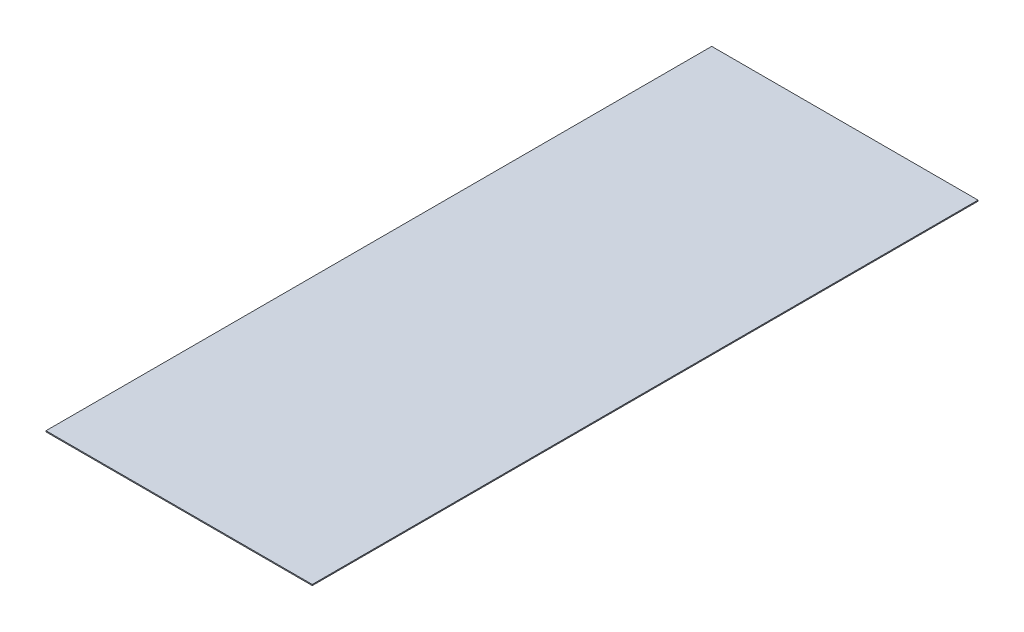
ISO-10303-21;
HEADER;
FILE_DESCRIPTION(('STEP AP214'),'2;1');
FILE_NAME('part.step','',(''),(''),'','','');
FILE_SCHEMA(('AUTOMOTIVE_DESIGN { 1 0 10303 214 1 1 1 1 }'));
ENDSEC;
DATA;
#1=APPLICATION_CONTEXT('core data for automotive mechanical design processes');
#2=APPLICATION_PROTOCOL_DEFINITION('international standard','automotive_design',2000,#1);
#3=PRODUCT_CONTEXT('',#1,'mechanical');
#4=PRODUCT('Part','Part','',(#3));
#5=PRODUCT_RELATED_PRODUCT_CATEGORY('part','',(#4));
#6=PRODUCT_DEFINITION_FORMATION('','',#4);
#7=PRODUCT_DEFINITION_CONTEXT('part definition',#1,'design');
#8=PRODUCT_DEFINITION('design','',#6,#7);
#9=PRODUCT_DEFINITION_SHAPE('','',#8);
#10=(LENGTH_UNIT() NAMED_UNIT(*) SI_UNIT(.MILLI.,.METRE.));
#11=(NAMED_UNIT(*) PLANE_ANGLE_UNIT() SI_UNIT($,.RADIAN.));
#12=(NAMED_UNIT(*) SI_UNIT($,.STERADIAN.) SOLID_ANGLE_UNIT());
#13=UNCERTAINTY_MEASURE_WITH_UNIT(LENGTH_MEASURE(1.E-05),#10,'distance_accuracy_value','');
#14=(GEOMETRIC_REPRESENTATION_CONTEXT(3) GLOBAL_UNCERTAINTY_ASSIGNED_CONTEXT((#13)) GLOBAL_UNIT_ASSIGNED_CONTEXT((#10,
#11,#12)) REPRESENTATION_CONTEXT('',''));
#15=CARTESIAN_POINT('',(0.,0.,0.));
#16=DIRECTION('',(0.,0.,1.));
#17=DIRECTION('',(1.,0.,0.));
#18=AXIS2_PLACEMENT_3D('',#15,#16,#17);
#19=CARTESIAN_POINT('',(609.6,4.8,1524.));
#20=DIRECTION('',(-1.,0.,0.));
#21=DIRECTION('',(0.,0.,1.));
#22=AXIS2_PLACEMENT_3D('',#19,#20,#21);
#23=PLANE('',#22);
#24=DIRECTION('',(0.,0.,-1.));
#25=VECTOR('',#24,1.);
#26=CARTESIAN_POINT('',(609.6,0.,1524.));
#27=LINE('',#26,#25);
#28=CARTESIAN_POINT('',(609.6,0.,1524.));
#29=VERTEX_POINT('',#28);
#30=CARTESIAN_POINT('',(609.6,0.,-1524.));
#31=VERTEX_POINT('',#30);
#32=EDGE_CURVE('E96',#29,#31,#27,.T.);
#33=ORIENTED_EDGE('',*,*,#32,.T.);
#34=DIRECTION('',(0.,-1.,0.));
#35=VECTOR('',#34,1.);
#36=CARTESIAN_POINT('',(609.6,4.8,-1524.));
#37=LINE('',#36,#35);
#38=CARTESIAN_POINT('',(609.6,4.8,-1524.));
#39=VERTEX_POINT('',#38);
#40=EDGE_CURVE('E11',#39,#31,#37,.T.);
#41=ORIENTED_EDGE('',*,*,#40,.F.);
#42=DIRECTION('',(0.,0.,-1.));
#43=VECTOR('',#42,1.);
#44=CARTESIAN_POINT('',(609.6,4.8,1524.));
#45=LINE('',#44,#43);
#46=CARTESIAN_POINT('',(609.6,4.8,1524.));
#47=VERTEX_POINT('',#46);
#48=EDGE_CURVE('E84',#47,#39,#45,.T.);
#49=ORIENTED_EDGE('',*,*,#48,.F.);
#50=DIRECTION('',(0.,-1.,0.));
#51=VECTOR('',#50,1.);
#52=CARTESIAN_POINT('',(609.6,4.8,1524.));
#53=LINE('',#52,#51);
#54=EDGE_CURVE('E92',#47,#29,#53,.T.);
#55=ORIENTED_EDGE('',*,*,#54,.T.);
#56=EDGE_LOOP('',(#33,#41,#49,#55));
#57=FACE_BOUND('',#56,.T.);
#58=ADVANCED_FACE('F33',(#57),#23,.F.);
#59=CARTESIAN_POINT('',(-609.6,4.8,-1524.));
#60=DIRECTION('',(0.,0.,1.));
#61=DIRECTION('',(1.,0.,0.));
#62=AXIS2_PLACEMENT_3D('',#59,#60,#61);
#63=PLANE('',#62);
#64=DIRECTION('',(-1.,0.,0.));
#65=VECTOR('',#64,1.);
#66=CARTESIAN_POINT('',(-609.6,0.,-1524.));
#67=LINE('',#66,#65);
#68=CARTESIAN_POINT('',(-609.6,0.,-1524.));
#69=VERTEX_POINT('',#68);
#70=EDGE_CURVE('E88',#31,#69,#67,.T.);
#71=ORIENTED_EDGE('',*,*,#70,.T.);
#72=DIRECTION('',(0.,-1.,0.));
#73=VECTOR('',#72,1.);
#74=CARTESIAN_POINT('',(-609.6,4.8,-1524.));
#75=LINE('',#74,#73);
#76=CARTESIAN_POINT('',(-609.6,4.8,-1524.));
#77=VERTEX_POINT('',#76);
#78=EDGE_CURVE('E41',#77,#69,#75,.T.);
#79=ORIENTED_EDGE('',*,*,#78,.F.);
#80=DIRECTION('',(-1.,0.,0.));
#81=VECTOR('',#80,1.);
#82=CARTESIAN_POINT('',(-609.6,4.8,-1524.));
#83=LINE('',#82,#81);
#84=EDGE_CURVE('E79',#39,#77,#83,.T.);
#85=ORIENTED_EDGE('',*,*,#84,.F.);
#86=ORIENTED_EDGE('',*,*,#40,.T.);
#87=EDGE_LOOP('',(#71,#79,#85,#86));
#88=FACE_BOUND('',#87,.T.);
#89=ADVANCED_FACE('F87',(#88),#63,.F.);
#90=CARTESIAN_POINT('',(-609.6,4.8,1524.));
#91=DIRECTION('',(1.,0.,0.));
#92=DIRECTION('',(0.,0.,-1.));
#93=AXIS2_PLACEMENT_3D('',#90,#91,#92);
#94=PLANE('',#93);
#95=DIRECTION('',(0.,0.,1.));
#96=VECTOR('',#95,1.);
#97=CARTESIAN_POINT('',(-609.6,0.,1524.));
#98=LINE('',#97,#96);
#99=CARTESIAN_POINT('',(-609.6,0.,1524.));
#100=VERTEX_POINT('',#99);
#101=EDGE_CURVE('E66',#69,#100,#98,.T.);
#102=ORIENTED_EDGE('',*,*,#101,.T.);
#103=DIRECTION('',(0.,-1.,0.));
#104=VECTOR('',#103,1.);
#105=CARTESIAN_POINT('',(-609.6,4.8,1524.));
#106=LINE('',#105,#104);
#107=CARTESIAN_POINT('',(-609.6,4.8,1524.));
#108=VERTEX_POINT('',#107);
#109=EDGE_CURVE('E89',#108,#100,#106,.T.);
#110=ORIENTED_EDGE('',*,*,#109,.F.);
#111=DIRECTION('',(0.,0.,1.));
#112=VECTOR('',#111,1.);
#113=CARTESIAN_POINT('',(-609.6,4.8,1524.));
#114=LINE('',#113,#112);
#115=EDGE_CURVE('E82',#77,#108,#114,.T.);
#116=ORIENTED_EDGE('',*,*,#115,.F.);
#117=ORIENTED_EDGE('',*,*,#78,.T.);
#118=EDGE_LOOP('',(#102,#110,#116,#117));
#119=FACE_BOUND('',#118,.T.);
#120=ADVANCED_FACE('F90',(#119),#94,.F.);
#121=CARTESIAN_POINT('',(-609.6,4.8,1524.));
#122=DIRECTION('',(0.,0.,-1.));
#123=DIRECTION('',(-1.,0.,0.));
#124=AXIS2_PLACEMENT_3D('',#121,#122,#123);
#125=PLANE('',#124);
#126=DIRECTION('',(1.,0.,0.));
#127=VECTOR('',#126,1.);
#128=CARTESIAN_POINT('',(-609.6,0.,1524.));
#129=LINE('',#128,#127);
#130=EDGE_CURVE('E72',#100,#29,#129,.T.);
#131=ORIENTED_EDGE('',*,*,#130,.T.);
#132=ORIENTED_EDGE('',*,*,#54,.F.);
#133=DIRECTION('',(1.,0.,0.));
#134=VECTOR('',#133,1.);
#135=CARTESIAN_POINT('',(-609.6,4.8,1524.));
#136=LINE('',#135,#134);
#137=EDGE_CURVE('E49',#108,#47,#136,.T.);
#138=ORIENTED_EDGE('',*,*,#137,.F.);
#139=ORIENTED_EDGE('',*,*,#109,.T.);
#140=EDGE_LOOP('',(#131,#132,#138,#139));
#141=FACE_BOUND('',#140,.T.);
#142=ADVANCED_FACE('F103',(#141),#125,.F.);
#143=CARTESIAN_POINT('',(0.,4.8,0.));
#144=DIRECTION('',(0.,-1.,0.));
#145=DIRECTION('',(0.,0.,-1.));
#146=AXIS2_PLACEMENT_3D('',#143,#144,#145);
#147=PLANE('',#146);
#148=ORIENTED_EDGE('',*,*,#48,.T.);
#149=ORIENTED_EDGE('',*,*,#84,.T.);
#150=ORIENTED_EDGE('',*,*,#115,.T.);
#151=ORIENTED_EDGE('',*,*,#137,.T.);
#152=EDGE_LOOP('',(#148,#149,#150,#151));
#153=FACE_BOUND('',#152,.T.);
#154=ADVANCED_FACE('F80',(#153),#147,.F.);
#155=CARTESIAN_POINT('',(0.,0.,0.));
#156=DIRECTION('',(0.,-1.,0.));
#157=DIRECTION('',(0.,0.,-1.));
#158=AXIS2_PLACEMENT_3D('',#155,#156,#157);
#159=PLANE('',#158);
#160=ORIENTED_EDGE('',*,*,#32,.F.);
#161=ORIENTED_EDGE('',*,*,#130,.F.);
#162=ORIENTED_EDGE('',*,*,#101,.F.);
#163=ORIENTED_EDGE('',*,*,#70,.F.);
#164=EDGE_LOOP('',(#160,#161,#162,#163));
#165=FACE_BOUND('',#164,.T.);
#166=ADVANCED_FACE('F106',(#165),#159,.T.);
#167=CLOSED_SHELL('',(#58,#89,#120,#142,#154,#166));
#168=MANIFOLD_SOLID_BREP('B2',#167);
#169=ADVANCED_BREP_SHAPE_REPRESENTATION('',(#18,#168),#14);
#170=SHAPE_DEFINITION_REPRESENTATION(#9,#169);
ENDSEC;
END-ISO-10303-21;
